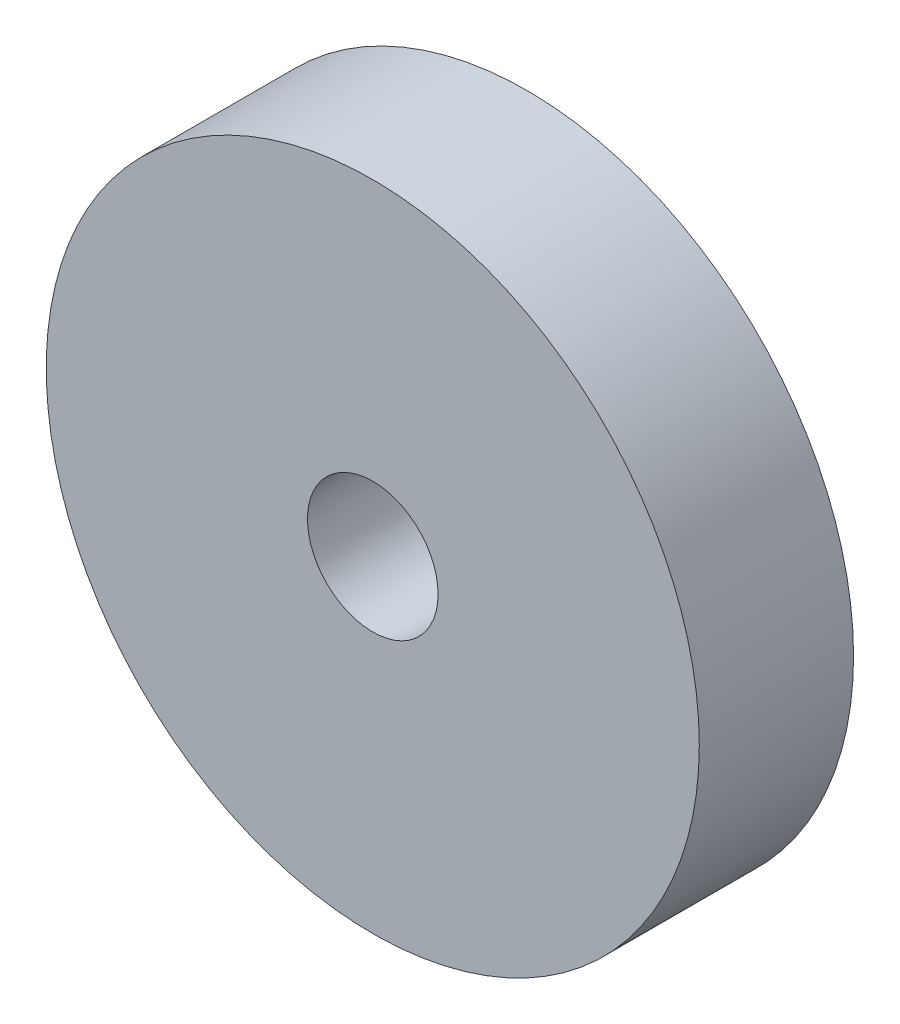
ISO-10303-21;
HEADER;
FILE_DESCRIPTION(('STEP AP214'),'2;1');
FILE_NAME('part.step','',(''),(''),'','','');
FILE_SCHEMA(('AUTOMOTIVE_DESIGN { 1 0 10303 214 1 1 1 1 }'));
ENDSEC;
DATA;
#1=APPLICATION_CONTEXT('core data for automotive mechanical design processes');
#2=APPLICATION_PROTOCOL_DEFINITION('international standard','automotive_design',2000,#1);
#3=PRODUCT_CONTEXT('',#1,'mechanical');
#4=PRODUCT('Part','Part','',(#3));
#5=PRODUCT_RELATED_PRODUCT_CATEGORY('part','',(#4));
#6=PRODUCT_DEFINITION_FORMATION('','',#4);
#7=PRODUCT_DEFINITION_CONTEXT('part definition',#1,'design');
#8=PRODUCT_DEFINITION('design','',#6,#7);
#9=PRODUCT_DEFINITION_SHAPE('','',#8);
#10=(LENGTH_UNIT() NAMED_UNIT(*) SI_UNIT(.MILLI.,.METRE.));
#11=(NAMED_UNIT(*) PLANE_ANGLE_UNIT() SI_UNIT($,.RADIAN.));
#12=(NAMED_UNIT(*) SI_UNIT($,.STERADIAN.) SOLID_ANGLE_UNIT());
#13=UNCERTAINTY_MEASURE_WITH_UNIT(LENGTH_MEASURE(1.E-05),#10,'distance_accuracy_value','');
#14=(GEOMETRIC_REPRESENTATION_CONTEXT(3) GLOBAL_UNCERTAINTY_ASSIGNED_CONTEXT((#13)) GLOBAL_UNIT_ASSIGNED_CONTEXT((#10,
#11,#12)) REPRESENTATION_CONTEXT('',''));
#15=CARTESIAN_POINT('',(0.,0.,0.));
#16=DIRECTION('',(0.,0.,1.));
#17=DIRECTION('',(1.,0.,0.));
#18=AXIS2_PLACEMENT_3D('',#15,#16,#17);
#19=CARTESIAN_POINT('',(0.,0.,30.));
#20=DIRECTION('',(0.,0.,1.));
#21=DIRECTION('',(1.,0.,0.));
#22=AXIS2_PLACEMENT_3D('',#19,#20,#21);
#23=PLANE('',#22);
#24=CARTESIAN_POINT('',(0.,0.,30.));
#25=DIRECTION('',(0.,0.,1.));
#26=DIRECTION('',(1.,0.,0.));
#27=AXIS2_PLACEMENT_3D('',#24,#25,#26);
#28=CIRCLE('',#27,63.5);
#29=CARTESIAN_POINT('',(63.5,0.,30.));
#30=VERTEX_POINT('',#29);
#31=EDGE_CURVE('E10',#30,#30,#28,.T.);
#32=ORIENTED_EDGE('',*,*,#31,.T.);
#33=EDGE_LOOP('',(#32));
#34=FACE_BOUND('',#33,.T.);
#35=CARTESIAN_POINT('',(0.,0.,30.));
#36=DIRECTION('',(0.,0.,1.));
#37=DIRECTION('',(1.,0.,0.));
#38=AXIS2_PLACEMENT_3D('',#35,#36,#37);
#39=CIRCLE('',#38,12.7);
#40=CARTESIAN_POINT('',(12.7,0.,30.));
#41=VERTEX_POINT('',#40);
#42=EDGE_CURVE('E42',#41,#41,#39,.T.);
#43=ORIENTED_EDGE('',*,*,#42,.F.);
#44=EDGE_LOOP('',(#43));
#45=FACE_BOUND('',#44,.T.);
#46=ADVANCED_FACE('F31',(#34,#45),#23,.T.);
#47=CARTESIAN_POINT('',(0.,0.,0.));
#48=DIRECTION('',(0.,0.,1.));
#49=DIRECTION('',(1.,0.,0.));
#50=AXIS2_PLACEMENT_3D('',#47,#48,#49);
#51=PLANE('',#50);
#52=CARTESIAN_POINT('',(0.,0.,0.));
#53=DIRECTION('',(0.,0.,1.));
#54=DIRECTION('',(1.,0.,0.));
#55=AXIS2_PLACEMENT_3D('',#52,#53,#54);
#56=CIRCLE('',#55,63.5);
#57=CARTESIAN_POINT('',(63.5,0.,0.));
#58=VERTEX_POINT('',#57);
#59=EDGE_CURVE('E35',#58,#58,#56,.T.);
#60=ORIENTED_EDGE('',*,*,#59,.F.);
#61=EDGE_LOOP('',(#60));
#62=FACE_BOUND('',#61,.T.);
#63=CARTESIAN_POINT('',(0.,0.,0.));
#64=DIRECTION('',(0.,0.,1.));
#65=DIRECTION('',(1.,0.,0.));
#66=AXIS2_PLACEMENT_3D('',#63,#64,#65);
#67=CIRCLE('',#66,12.7);
#68=CARTESIAN_POINT('',(12.7,0.,0.));
#69=VERTEX_POINT('',#68);
#70=EDGE_CURVE('E44',#69,#69,#67,.T.);
#71=ORIENTED_EDGE('',*,*,#70,.T.);
#72=EDGE_LOOP('',(#71));
#73=FACE_BOUND('',#72,.T.);
#74=ADVANCED_FACE('F54',(#62,#73),#51,.F.);
#75=CARTESIAN_POINT('',(0.,0.,30.));
#76=DIRECTION('',(0.,0.,-1.));
#77=DIRECTION('',(-1.,0.,0.));
#78=AXIS2_PLACEMENT_3D('',#75,#76,#77);
#79=CYLINDRICAL_SURFACE('',#78,63.5);
#80=ORIENTED_EDGE('',*,*,#31,.F.);
#81=EDGE_LOOP('',(#80));
#82=FACE_BOUND('',#81,.T.);
#83=ORIENTED_EDGE('',*,*,#59,.T.);
#84=EDGE_LOOP('',(#83));
#85=FACE_BOUND('',#84,.T.);
#86=ADVANCED_FACE('F33',(#82,#85),#79,.T.);
#87=CARTESIAN_POINT('',(0.,0.,30.));
#88=DIRECTION('',(0.,0.,-1.));
#89=DIRECTION('',(-1.,0.,0.));
#90=AXIS2_PLACEMENT_3D('',#87,#88,#89);
#91=CYLINDRICAL_SURFACE('',#90,12.7);
#92=ORIENTED_EDGE('',*,*,#42,.T.);
#93=EDGE_LOOP('',(#92));
#94=FACE_BOUND('',#93,.T.);
#95=ORIENTED_EDGE('',*,*,#70,.F.);
#96=EDGE_LOOP('',(#95));
#97=FACE_BOUND('',#96,.T.);
#98=ADVANCED_FACE('F50',(#94,#97),#91,.F.);
#99=CLOSED_SHELL('',(#46,#74,#86,#98));
#100=MANIFOLD_SOLID_BREP('B2',#99);
#101=ADVANCED_BREP_SHAPE_REPRESENTATION('',(#18,#100),#14);
#102=SHAPE_DEFINITION_REPRESENTATION(#9,#101);
ENDSEC;
END-ISO-10303-21;
